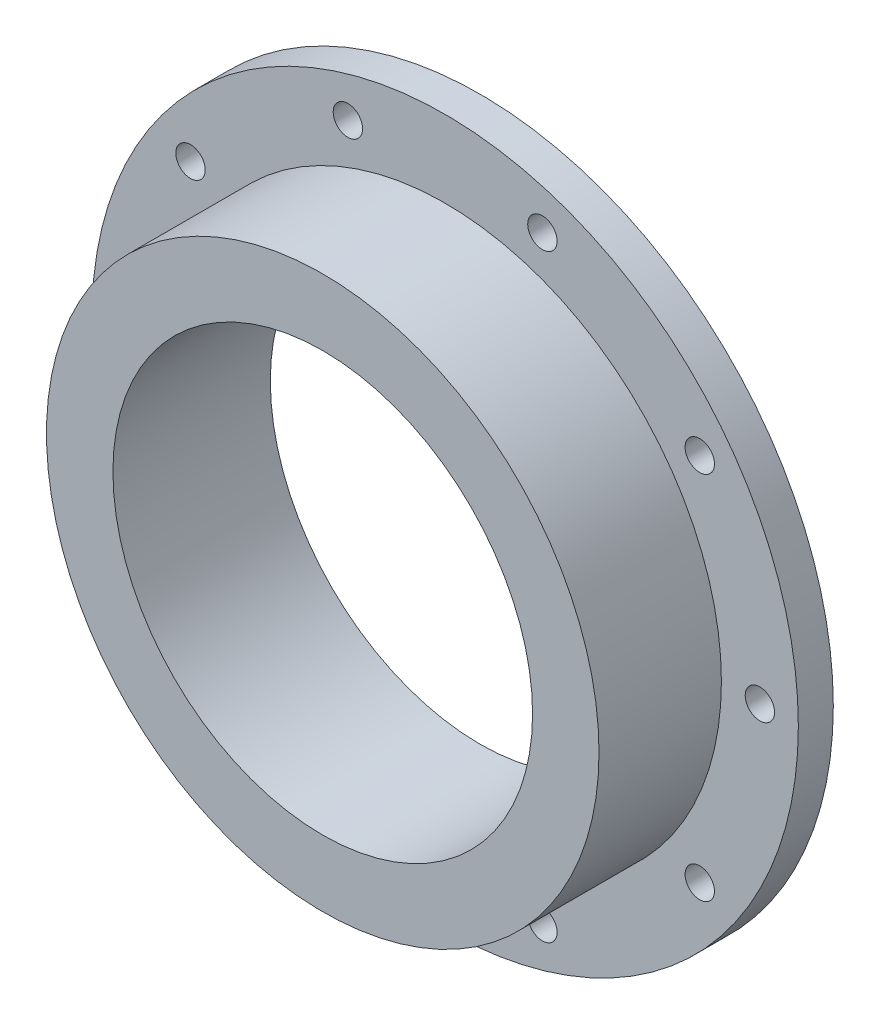
ISO-10303-21;
HEADER;
FILE_DESCRIPTION(('STEP AP214'),'2;1');
FILE_NAME('part.step','',(''),(''),'','','');
FILE_SCHEMA(('AUTOMOTIVE_DESIGN { 1 0 10303 214 1 1 1 1 }'));
ENDSEC;
DATA;
#1=APPLICATION_CONTEXT('core data for automotive mechanical design processes');
#2=APPLICATION_PROTOCOL_DEFINITION('international standard','automotive_design',2000,#1);
#3=PRODUCT_CONTEXT('',#1,'mechanical');
#4=PRODUCT('Part','Part','',(#3));
#5=PRODUCT_RELATED_PRODUCT_CATEGORY('part','',(#4));
#6=PRODUCT_DEFINITION_FORMATION('','',#4);
#7=PRODUCT_DEFINITION_CONTEXT('part definition',#1,'design');
#8=PRODUCT_DEFINITION('design','',#6,#7);
#9=PRODUCT_DEFINITION_SHAPE('','',#8);
#10=(LENGTH_UNIT() NAMED_UNIT(*) SI_UNIT(.MILLI.,.METRE.));
#11=(NAMED_UNIT(*) PLANE_ANGLE_UNIT() SI_UNIT($,.RADIAN.));
#12=(NAMED_UNIT(*) SI_UNIT($,.STERADIAN.) SOLID_ANGLE_UNIT());
#13=UNCERTAINTY_MEASURE_WITH_UNIT(LENGTH_MEASURE(1.E-05),#10,'distance_accuracy_value','');
#14=(GEOMETRIC_REPRESENTATION_CONTEXT(3) GLOBAL_UNCERTAINTY_ASSIGNED_CONTEXT((#13)) GLOBAL_UNIT_ASSIGNED_CONTEXT((#10,
#11,#12)) REPRESENTATION_CONTEXT('',''));
#15=CARTESIAN_POINT('',(0.,0.,0.));
#16=DIRECTION('',(0.,0.,1.));
#17=DIRECTION('',(1.,0.,0.));
#18=AXIS2_PLACEMENT_3D('',#15,#16,#17);
#19=CARTESIAN_POINT('',(0.,0.,-10.));
#20=DIRECTION('',(0.,0.,1.));
#21=DIRECTION('',(1.,0.,0.));
#22=AXIS2_PLACEMENT_3D('',#19,#20,#21);
#23=CYLINDRICAL_SURFACE('',#22,101.);
#24=CARTESIAN_POINT('',(0.,0.,-10.));
#25=DIRECTION('',(0.,0.,1.));
#26=DIRECTION('',(1.,0.,0.));
#27=AXIS2_PLACEMENT_3D('',#24,#25,#26);
#28=CIRCLE('',#27,101.);
#29=CARTESIAN_POINT('',(101.,0.,-10.));
#30=VERTEX_POINT('',#29);
#31=EDGE_CURVE('E46',#30,#30,#28,.T.);
#32=ORIENTED_EDGE('',*,*,#31,.T.);
#33=EDGE_LOOP('',(#32));
#34=FACE_BOUND('',#33,.T.);
#35=CARTESIAN_POINT('',(0.,0.,0.));
#36=DIRECTION('',(0.,0.,1.));
#37=DIRECTION('',(1.,0.,0.));
#38=AXIS2_PLACEMENT_3D('',#35,#36,#37);
#39=CIRCLE('',#38,101.);
#40=CARTESIAN_POINT('',(101.,0.,0.));
#41=VERTEX_POINT('',#40);
#42=EDGE_CURVE('E113',#41,#41,#39,.T.);
#43=ORIENTED_EDGE('',*,*,#42,.F.);
#44=EDGE_LOOP('',(#43));
#45=FACE_BOUND('',#44,.T.);
#46=ADVANCED_FACE('F43',(#34,#45),#23,.T.);
#47=CARTESIAN_POINT('',(101.,0.,-10.));
#48=DIRECTION('',(0.,0.,-1.));
#49=DIRECTION('',(-1.,0.,0.));
#50=AXIS2_PLACEMENT_3D('',#47,#48,#49);
#51=PLANE('',#50);
#52=CARTESIAN_POINT('',(0.,0.,-9.99999999999999));
#53=DIRECTION('',(0.,0.,-1.));
#54=DIRECTION('',(-1.,0.,0.));
#55=AXIS2_PLACEMENT_3D('',#52,#53,#54);
#56=CIRCLE('',#55,60.);
#57=CARTESIAN_POINT('',(-60.,0.,-9.99999999999999));
#58=VERTEX_POINT('',#57);
#59=EDGE_CURVE('E242',#58,#58,#56,.T.);
#60=ORIENTED_EDGE('',*,*,#59,.F.);
#61=EDGE_LOOP('',(#60));
#62=FACE_BOUND('',#61,.T.);
#63=CARTESIAN_POINT('',(-27.8115294937453,85.5950864665638,-10.));
#64=DIRECTION('',(0.,0.,-1.));
#65=DIRECTION('',(-1.,0.,0.));
#66=AXIS2_PLACEMENT_3D('',#63,#64,#65);
#67=CIRCLE('',#66,4.19999999999999);
#68=CARTESIAN_POINT('',(-32.0115294937452,85.5950864665638,-10.));
#69=VERTEX_POINT('',#68);
#70=EDGE_CURVE('E236',#69,#69,#67,.T.);
#71=ORIENTED_EDGE('',*,*,#70,.F.);
#72=EDGE_LOOP('',(#71));
#73=FACE_BOUND('',#72,.T.);
#74=CARTESIAN_POINT('',(-72.8115294937453,52.9006727063226,-10.));
#75=DIRECTION('',(0.,0.,-1.));
#76=DIRECTION('',(-1.,0.,0.));
#77=AXIS2_PLACEMENT_3D('',#74,#75,#76);
#78=CIRCLE('',#77,4.19999999999998);
#79=CARTESIAN_POINT('',(-77.0115294937453,52.9006727063226,-10.));
#80=VERTEX_POINT('',#79);
#81=EDGE_CURVE('E230',#80,#80,#78,.T.);
#82=ORIENTED_EDGE('',*,*,#81,.F.);
#83=EDGE_LOOP('',(#82));
#84=FACE_BOUND('',#83,.T.);
#85=CARTESIAN_POINT('',(-90.,0.,-10.));
#86=DIRECTION('',(0.,0.,-1.));
#87=DIRECTION('',(-1.,0.,0.));
#88=AXIS2_PLACEMENT_3D('',#85,#86,#87);
#89=CIRCLE('',#88,4.19999999999998);
#90=CARTESIAN_POINT('',(-94.2,0.,-10.));
#91=VERTEX_POINT('',#90);
#92=EDGE_CURVE('E224',#91,#91,#89,.T.);
#93=ORIENTED_EDGE('',*,*,#92,.F.);
#94=EDGE_LOOP('',(#93));
#95=FACE_BOUND('',#94,.T.);
#96=CARTESIAN_POINT('',(-72.8115294937453,-52.9006727063226,-10.));
#97=DIRECTION('',(0.,0.,-1.));
#98=DIRECTION('',(-1.,0.,0.));
#99=AXIS2_PLACEMENT_3D('',#96,#97,#98);
#100=CIRCLE('',#99,4.19999999999998);
#101=CARTESIAN_POINT('',(-77.0115294937453,-52.9006727063226,-10.));
#102=VERTEX_POINT('',#101);
#103=EDGE_CURVE('E218',#102,#102,#100,.T.);
#104=ORIENTED_EDGE('',*,*,#103,.F.);
#105=EDGE_LOOP('',(#104));
#106=FACE_BOUND('',#105,.T.);
#107=CARTESIAN_POINT('',(-27.8115294937453,-85.5950864665638,-10.));
#108=DIRECTION('',(0.,0.,-1.));
#109=DIRECTION('',(-1.,0.,0.));
#110=AXIS2_PLACEMENT_3D('',#107,#108,#109);
#111=CIRCLE('',#110,4.19999999999999);
#112=CARTESIAN_POINT('',(-32.0115294937452,-85.5950864665638,-10.));
#113=VERTEX_POINT('',#112);
#114=EDGE_CURVE('E212',#113,#113,#111,.T.);
#115=ORIENTED_EDGE('',*,*,#114,.F.);
#116=EDGE_LOOP('',(#115));
#117=FACE_BOUND('',#116,.T.);
#118=CARTESIAN_POINT('',(27.8115294937453,-85.5950864665638,-10.));
#119=DIRECTION('',(0.,0.,-1.));
#120=DIRECTION('',(-1.,0.,0.));
#121=AXIS2_PLACEMENT_3D('',#118,#119,#120);
#122=CIRCLE('',#121,4.19999999999999);
#123=CARTESIAN_POINT('',(23.6115294937453,-85.5950864665638,-10.));
#124=VERTEX_POINT('',#123);
#125=EDGE_CURVE('E206',#124,#124,#122,.T.);
#126=ORIENTED_EDGE('',*,*,#125,.F.);
#127=EDGE_LOOP('',(#126));
#128=FACE_BOUND('',#127,.T.);
#129=CARTESIAN_POINT('',(72.8115294937453,-52.9006727063226,-10.));
#130=DIRECTION('',(0.,0.,-1.));
#131=DIRECTION('',(-1.,0.,0.));
#132=AXIS2_PLACEMENT_3D('',#129,#130,#131);
#133=CIRCLE('',#132,4.19999999999998);
#134=CARTESIAN_POINT('',(68.6115294937453,-52.9006727063226,-10.));
#135=VERTEX_POINT('',#134);
#136=EDGE_CURVE('E200',#135,#135,#133,.T.);
#137=ORIENTED_EDGE('',*,*,#136,.F.);
#138=EDGE_LOOP('',(#137));
#139=FACE_BOUND('',#138,.T.);
#140=CARTESIAN_POINT('',(90.,0.,-10.));
#141=DIRECTION('',(0.,0.,-1.));
#142=DIRECTION('',(-1.,0.,0.));
#143=AXIS2_PLACEMENT_3D('',#140,#141,#142);
#144=CIRCLE('',#143,4.19999999999998);
#145=CARTESIAN_POINT('',(85.8,0.,-10.));
#146=VERTEX_POINT('',#145);
#147=EDGE_CURVE('E194',#146,#146,#144,.T.);
#148=ORIENTED_EDGE('',*,*,#147,.F.);
#149=EDGE_LOOP('',(#148));
#150=FACE_BOUND('',#149,.T.);
#151=CARTESIAN_POINT('',(72.8115294937453,52.9006727063226,-10.));
#152=DIRECTION('',(0.,0.,-1.));
#153=DIRECTION('',(-1.,0.,0.));
#154=AXIS2_PLACEMENT_3D('',#151,#152,#153);
#155=CIRCLE('',#154,4.19999999999998);
#156=CARTESIAN_POINT('',(68.6115294937453,52.9006727063226,-10.));
#157=VERTEX_POINT('',#156);
#158=EDGE_CURVE('E188',#157,#157,#155,.T.);
#159=ORIENTED_EDGE('',*,*,#158,.F.);
#160=EDGE_LOOP('',(#159));
#161=FACE_BOUND('',#160,.T.);
#162=CARTESIAN_POINT('',(27.8115294937453,85.5950864665638,-10.));
#163=DIRECTION('',(0.,0.,-1.));
#164=DIRECTION('',(-1.,0.,0.));
#165=AXIS2_PLACEMENT_3D('',#162,#163,#164);
#166=CIRCLE('',#165,4.19999999999999);
#167=CARTESIAN_POINT('',(23.6115294937453,85.5950864665638,-10.));
#168=VERTEX_POINT('',#167);
#169=EDGE_CURVE('E182',#168,#168,#166,.T.);
#170=ORIENTED_EDGE('',*,*,#169,.F.);
#171=EDGE_LOOP('',(#170));
#172=FACE_BOUND('',#171,.T.);
#173=CARTESIAN_POINT('',(-40.8510750343269,56.2266811090589,-10.));
#174=DIRECTION('',(0.,0.,1.));
#175=DIRECTION('',(1.,0.,0.));
#176=AXIS2_PLACEMENT_3D('',#173,#174,#175);
#177=CIRCLE('',#176,3.3235);
#178=CARTESIAN_POINT('',(-37.5275750343269,56.2266811090589,-10.));
#179=VERTEX_POINT('',#178);
#180=EDGE_CURVE('E173',#179,#179,#177,.T.);
#181=ORIENTED_EDGE('',*,*,#180,.T.);
#182=EDGE_LOOP('',(#181));
#183=FACE_BOUND('',#182,.T.);
#184=CARTESIAN_POINT('',(-66.0984278825132,21.4766811090588,-10.));
#185=DIRECTION('',(0.,0.,1.));
#186=DIRECTION('',(1.,0.,0.));
#187=AXIS2_PLACEMENT_3D('',#184,#185,#186);
#188=CIRCLE('',#187,3.32349999999999);
#189=CARTESIAN_POINT('',(-62.7749278825132,21.4766811090588,-10.));
#190=VERTEX_POINT('',#189);
#191=EDGE_CURVE('E167',#190,#190,#188,.T.);
#192=ORIENTED_EDGE('',*,*,#191,.T.);
#193=EDGE_LOOP('',(#192));
#194=FACE_BOUND('',#193,.T.);
#195=CARTESIAN_POINT('',(-66.0984278825132,-21.4766811090588,-10.));
#196=DIRECTION('',(0.,0.,1.));
#197=DIRECTION('',(1.,0.,0.));
#198=AXIS2_PLACEMENT_3D('',#195,#196,#197);
#199=CIRCLE('',#198,3.32349999999999);
#200=CARTESIAN_POINT('',(-62.7749278825132,-21.4766811090588,-10.));
#201=VERTEX_POINT('',#200);
#202=EDGE_CURVE('E161',#201,#201,#199,.T.);
#203=ORIENTED_EDGE('',*,*,#202,.T.);
#204=EDGE_LOOP('',(#203));
#205=FACE_BOUND('',#204,.T.);
#206=CARTESIAN_POINT('',(-40.8510750343269,-56.2266811090589,-10.));
#207=DIRECTION('',(0.,0.,1.));
#208=DIRECTION('',(1.,0.,0.));
#209=AXIS2_PLACEMENT_3D('',#206,#207,#208);
#210=CIRCLE('',#209,3.3235);
#211=CARTESIAN_POINT('',(-37.5275750343269,-56.2266811090589,-10.));
#212=VERTEX_POINT('',#211);
#213=EDGE_CURVE('E155',#212,#212,#210,.T.);
#214=ORIENTED_EDGE('',*,*,#213,.T.);
#215=EDGE_LOOP('',(#214));
#216=FACE_BOUND('',#215,.T.);
#217=CARTESIAN_POINT('',(0.,-69.5,-10.));
#218=DIRECTION('',(0.,0.,1.));
#219=DIRECTION('',(1.,0.,0.));
#220=AXIS2_PLACEMENT_3D('',#217,#218,#219);
#221=CIRCLE('',#220,3.3235);
#222=CARTESIAN_POINT('',(3.32350000000001,-69.5,-10.));
#223=VERTEX_POINT('',#222);
#224=EDGE_CURVE('E149',#223,#223,#221,.T.);
#225=ORIENTED_EDGE('',*,*,#224,.T.);
#226=EDGE_LOOP('',(#225));
#227=FACE_BOUND('',#226,.T.);
#228=CARTESIAN_POINT('',(40.8510750343269,-56.2266811090589,-10.));
#229=DIRECTION('',(0.,0.,1.));
#230=DIRECTION('',(1.,0.,0.));
#231=AXIS2_PLACEMENT_3D('',#228,#229,#230);
#232=CIRCLE('',#231,3.3235);
#233=CARTESIAN_POINT('',(44.1745750343269,-56.2266811090589,-10.));
#234=VERTEX_POINT('',#233);
#235=EDGE_CURVE('E143',#234,#234,#232,.T.);
#236=ORIENTED_EDGE('',*,*,#235,.T.);
#237=EDGE_LOOP('',(#236));
#238=FACE_BOUND('',#237,.T.);
#239=CARTESIAN_POINT('',(66.0984278825132,-21.4766811090588,-10.));
#240=DIRECTION('',(0.,0.,1.));
#241=DIRECTION('',(1.,0.,0.));
#242=AXIS2_PLACEMENT_3D('',#239,#240,#241);
#243=CIRCLE('',#242,3.32349999999999);
#244=CARTESIAN_POINT('',(69.4219278825132,-21.4766811090588,-10.));
#245=VERTEX_POINT('',#244);
#246=EDGE_CURVE('E137',#245,#245,#243,.T.);
#247=ORIENTED_EDGE('',*,*,#246,.T.);
#248=EDGE_LOOP('',(#247));
#249=FACE_BOUND('',#248,.T.);
#250=CARTESIAN_POINT('',(66.0984278825132,21.4766811090588,-10.));
#251=DIRECTION('',(0.,0.,1.));
#252=DIRECTION('',(1.,0.,0.));
#253=AXIS2_PLACEMENT_3D('',#250,#251,#252);
#254=CIRCLE('',#253,3.32349999999999);
#255=CARTESIAN_POINT('',(69.4219278825132,21.4766811090588,-10.));
#256=VERTEX_POINT('',#255);
#257=EDGE_CURVE('E131',#256,#256,#254,.T.);
#258=ORIENTED_EDGE('',*,*,#257,.T.);
#259=EDGE_LOOP('',(#258));
#260=FACE_BOUND('',#259,.T.);
#261=CARTESIAN_POINT('',(40.8510750343269,56.2266811090589,-10.));
#262=DIRECTION('',(0.,0.,1.));
#263=DIRECTION('',(1.,0.,0.));
#264=AXIS2_PLACEMENT_3D('',#261,#262,#263);
#265=CIRCLE('',#264,3.3235);
#266=CARTESIAN_POINT('',(44.1745750343269,56.2266811090589,-10.));
#267=VERTEX_POINT('',#266);
#268=EDGE_CURVE('E125',#267,#267,#265,.T.);
#269=ORIENTED_EDGE('',*,*,#268,.T.);
#270=EDGE_LOOP('',(#269));
#271=FACE_BOUND('',#270,.T.);
#272=CARTESIAN_POINT('',(0.,69.5,-10.));
#273=DIRECTION('',(0.,0.,1.));
#274=DIRECTION('',(1.,0.,0.));
#275=AXIS2_PLACEMENT_3D('',#272,#273,#274);
#276=CIRCLE('',#275,3.3235);
#277=CARTESIAN_POINT('',(3.3235,69.5,-10.));
#278=VERTEX_POINT('',#277);
#279=EDGE_CURVE('E117',#278,#278,#276,.T.);
#280=ORIENTED_EDGE('',*,*,#279,.T.);
#281=EDGE_LOOP('',(#280));
#282=FACE_BOUND('',#281,.T.);
#283=ORIENTED_EDGE('',*,*,#31,.F.);
#284=EDGE_LOOP('',(#283));
#285=FACE_BOUND('',#284,.T.);
#286=ADVANCED_FACE('F100',(#62,#73,#84,#95,#106,#117,#128,#139,#150,#161,#172,#183,#194,#205,
#216,#227,#238,#249,#260,#271,#282,#285),#51,.T.);
#287=CARTESIAN_POINT('',(0.,0.,0.));
#288=DIRECTION('',(0.,0.,1.));
#289=DIRECTION('',(1.,0.,0.));
#290=AXIS2_PLACEMENT_3D('',#287,#288,#289);
#291=PLANE('',#290);
#292=CARTESIAN_POINT('',(-27.8115294937453,85.5950864665638,0.));
#293=DIRECTION('',(0.,0.,1.));
#294=DIRECTION('',(1.,0.,0.));
#295=AXIS2_PLACEMENT_3D('',#292,#293,#294);
#296=CIRCLE('',#295,4.19999999999998);
#297=CARTESIAN_POINT('',(-23.6115294937453,85.5950864665638,0.));
#298=VERTEX_POINT('',#297);
#299=EDGE_CURVE('E233',#298,#298,#296,.T.);
#300=ORIENTED_EDGE('',*,*,#299,.F.);
#301=EDGE_LOOP('',(#300));
#302=FACE_BOUND('',#301,.T.);
#303=CARTESIAN_POINT('',(-72.8115294937453,52.9006727063226,0.));
#304=DIRECTION('',(0.,0.,1.));
#305=DIRECTION('',(1.,0.,0.));
#306=AXIS2_PLACEMENT_3D('',#303,#304,#305);
#307=CIRCLE('',#306,4.19999999999998);
#308=CARTESIAN_POINT('',(-68.6115294937453,52.9006727063226,0.));
#309=VERTEX_POINT('',#308);
#310=EDGE_CURVE('E227',#309,#309,#307,.T.);
#311=ORIENTED_EDGE('',*,*,#310,.F.);
#312=EDGE_LOOP('',(#311));
#313=FACE_BOUND('',#312,.T.);
#314=CARTESIAN_POINT('',(-90.,0.,0.));
#315=DIRECTION('',(0.,0.,1.));
#316=DIRECTION('',(1.,0.,0.));
#317=AXIS2_PLACEMENT_3D('',#314,#315,#316);
#318=CIRCLE('',#317,4.19999999999998);
#319=CARTESIAN_POINT('',(-85.8,0.,0.));
#320=VERTEX_POINT('',#319);
#321=EDGE_CURVE('E221',#320,#320,#318,.T.);
#322=ORIENTED_EDGE('',*,*,#321,.F.);
#323=EDGE_LOOP('',(#322));
#324=FACE_BOUND('',#323,.T.);
#325=CARTESIAN_POINT('',(-72.8115294937453,-52.9006727063226,0.));
#326=DIRECTION('',(0.,0.,1.));
#327=DIRECTION('',(1.,0.,0.));
#328=AXIS2_PLACEMENT_3D('',#325,#326,#327);
#329=CIRCLE('',#328,4.19999999999998);
#330=CARTESIAN_POINT('',(-68.6115294937453,-52.9006727063226,0.));
#331=VERTEX_POINT('',#330);
#332=EDGE_CURVE('E215',#331,#331,#329,.T.);
#333=ORIENTED_EDGE('',*,*,#332,.F.);
#334=EDGE_LOOP('',(#333));
#335=FACE_BOUND('',#334,.T.);
#336=CARTESIAN_POINT('',(-27.8115294937453,-85.5950864665638,0.));
#337=DIRECTION('',(0.,0.,1.));
#338=DIRECTION('',(1.,0.,0.));
#339=AXIS2_PLACEMENT_3D('',#336,#337,#338);
#340=CIRCLE('',#339,4.19999999999998);
#341=CARTESIAN_POINT('',(-23.6115294937453,-85.5950864665638,0.));
#342=VERTEX_POINT('',#341);
#343=EDGE_CURVE('E209',#342,#342,#340,.T.);
#344=ORIENTED_EDGE('',*,*,#343,.F.);
#345=EDGE_LOOP('',(#344));
#346=FACE_BOUND('',#345,.T.);
#347=CARTESIAN_POINT('',(27.8115294937453,-85.5950864665638,0.));
#348=DIRECTION('',(0.,0.,1.));
#349=DIRECTION('',(1.,0.,0.));
#350=AXIS2_PLACEMENT_3D('',#347,#348,#349);
#351=CIRCLE('',#350,4.19999999999998);
#352=CARTESIAN_POINT('',(32.0115294937453,-85.5950864665638,0.));
#353=VERTEX_POINT('',#352);
#354=EDGE_CURVE('E203',#353,#353,#351,.T.);
#355=ORIENTED_EDGE('',*,*,#354,.F.);
#356=EDGE_LOOP('',(#355));
#357=FACE_BOUND('',#356,.T.);
#358=CARTESIAN_POINT('',(72.8115294937453,-52.9006727063226,0.));
#359=DIRECTION('',(0.,0.,1.));
#360=DIRECTION('',(1.,0.,0.));
#361=AXIS2_PLACEMENT_3D('',#358,#359,#360);
#362=CIRCLE('',#361,4.19999999999998);
#363=CARTESIAN_POINT('',(77.0115294937453,-52.9006727063226,0.));
#364=VERTEX_POINT('',#363);
#365=EDGE_CURVE('E197',#364,#364,#362,.T.);
#366=ORIENTED_EDGE('',*,*,#365,.F.);
#367=EDGE_LOOP('',(#366));
#368=FACE_BOUND('',#367,.T.);
#369=CARTESIAN_POINT('',(90.,0.,0.));
#370=DIRECTION('',(0.,0.,1.));
#371=DIRECTION('',(1.,0.,0.));
#372=AXIS2_PLACEMENT_3D('',#369,#370,#371);
#373=CIRCLE('',#372,4.19999999999998);
#374=CARTESIAN_POINT('',(94.2,0.,0.));
#375=VERTEX_POINT('',#374);
#376=EDGE_CURVE('E191',#375,#375,#373,.T.);
#377=ORIENTED_EDGE('',*,*,#376,.F.);
#378=EDGE_LOOP('',(#377));
#379=FACE_BOUND('',#378,.T.);
#380=CARTESIAN_POINT('',(72.8115294937453,52.9006727063226,0.));
#381=DIRECTION('',(0.,0.,1.));
#382=DIRECTION('',(1.,0.,0.));
#383=AXIS2_PLACEMENT_3D('',#380,#381,#382);
#384=CIRCLE('',#383,4.19999999999998);
#385=CARTESIAN_POINT('',(77.0115294937453,52.9006727063226,0.));
#386=VERTEX_POINT('',#385);
#387=EDGE_CURVE('E185',#386,#386,#384,.T.);
#388=ORIENTED_EDGE('',*,*,#387,.F.);
#389=EDGE_LOOP('',(#388));
#390=FACE_BOUND('',#389,.T.);
#391=CARTESIAN_POINT('',(27.8115294937453,85.5950864665638,0.));
#392=DIRECTION('',(0.,0.,1.));
#393=DIRECTION('',(1.,0.,0.));
#394=AXIS2_PLACEMENT_3D('',#391,#392,#393);
#395=CIRCLE('',#394,4.19999999999998);
#396=CARTESIAN_POINT('',(32.0115294937453,85.5950864665638,0.));
#397=VERTEX_POINT('',#396);
#398=EDGE_CURVE('E179',#397,#397,#395,.T.);
#399=ORIENTED_EDGE('',*,*,#398,.F.);
#400=EDGE_LOOP('',(#399));
#401=FACE_BOUND('',#400,.T.);
#402=CARTESIAN_POINT('',(0.,0.,0.));
#403=DIRECTION('',(0.,0.,1.));
#404=DIRECTION('',(1.,0.,0.));
#405=AXIS2_PLACEMENT_3D('',#402,#403,#404);
#406=CIRCLE('',#405,79.);
#407=CARTESIAN_POINT('',(79.,0.,0.));
#408=VERTEX_POINT('',#407);
#409=EDGE_CURVE('E11',#408,#408,#406,.T.);
#410=ORIENTED_EDGE('',*,*,#409,.F.);
#411=EDGE_LOOP('',(#410));
#412=FACE_BOUND('',#411,.T.);
#413=ORIENTED_EDGE('',*,*,#42,.T.);
#414=EDGE_LOOP('',(#413));
#415=FACE_BOUND('',#414,.T.);
#416=ADVANCED_FACE('F106',(#302,#313,#324,#335,#346,#357,#368,#379,#390,#401,#412,#415),#291,.T.);
#417=CARTESIAN_POINT('',(0.,0.,35.));
#418=DIRECTION('',(0.,0.,-1.));
#419=DIRECTION('',(-1.,0.,0.));
#420=AXIS2_PLACEMENT_3D('',#417,#418,#419);
#421=CYLINDRICAL_SURFACE('',#420,79.);
#422=CARTESIAN_POINT('',(0.,0.,35.));
#423=DIRECTION('',(0.,0.,1.));
#424=DIRECTION('',(1.,0.,0.));
#425=AXIS2_PLACEMENT_3D('',#422,#423,#424);
#426=CIRCLE('',#425,79.);
#427=CARTESIAN_POINT('',(79.,0.,35.));
#428=VERTEX_POINT('',#427);
#429=EDGE_CURVE('E115',#428,#428,#426,.T.);
#430=ORIENTED_EDGE('',*,*,#429,.F.);
#431=EDGE_LOOP('',(#430));
#432=FACE_BOUND('',#431,.T.);
#433=ORIENTED_EDGE('',*,*,#409,.T.);
#434=EDGE_LOOP('',(#433));
#435=FACE_BOUND('',#434,.T.);
#436=ADVANCED_FACE('F303',(#432,#435),#421,.T.);
#437=CARTESIAN_POINT('',(0.,0.,35.));
#438=DIRECTION('',(0.,0.,1.));
#439=DIRECTION('',(1.,0.,0.));
#440=AXIS2_PLACEMENT_3D('',#437,#438,#439);
#441=PLANE('',#440);
#442=CARTESIAN_POINT('',(0.,0.,35.));
#443=DIRECTION('',(0.,0.,-1.));
#444=DIRECTION('',(-1.,0.,0.));
#445=AXIS2_PLACEMENT_3D('',#442,#443,#444);
#446=CIRCLE('',#445,60.);
#447=CARTESIAN_POINT('',(-60.,0.,35.));
#448=VERTEX_POINT('',#447);
#449=EDGE_CURVE('E239',#448,#448,#446,.T.);
#450=ORIENTED_EDGE('',*,*,#449,.T.);
#451=EDGE_LOOP('',(#450));
#452=FACE_BOUND('',#451,.T.);
#453=ORIENTED_EDGE('',*,*,#429,.T.);
#454=EDGE_LOOP('',(#453));
#455=FACE_BOUND('',#454,.T.);
#456=ADVANCED_FACE('F298',(#452,#455),#441,.T.);
#457=CARTESIAN_POINT('',(0.,69.5,5.));
#458=DIRECTION('',(0.,0.,-1.));
#459=DIRECTION('',(-1.,0.,0.));
#460=AXIS2_PLACEMENT_3D('',#457,#458,#459);
#461=CONICAL_SURFACE('',#460,0.,1.02974425867665);
#462=CARTESIAN_POINT('',(0.,69.5,3.0030397326619));
#463=DIRECTION('',(0.,0.,1.));
#464=DIRECTION('',(1.,0.,0.));
#465=AXIS2_PLACEMENT_3D('',#462,#463,#464);
#466=CIRCLE('',#465,3.3235);
#467=CARTESIAN_POINT('',(3.3235,69.5,3.0030397326619));
#468=VERTEX_POINT('',#467);
#469=EDGE_CURVE('E122',#468,#468,#466,.T.);
#470=ORIENTED_EDGE('',*,*,#469,.F.);
#471=EDGE_LOOP('',(#470));
#472=FACE_BOUND('',#471,.T.);
#473=CARTESIAN_POINT('',(0.,69.5,5.));
#474=VERTEX_POINT('',#473);
#475=VERTEX_LOOP('',#474);
#476=FACE_BOUND('',#475,.T.);
#477=ADVANCED_FACE('F293',(#472,#476),#461,.F.);
#478=CARTESIAN_POINT('',(0.,69.5,-10.));
#479=DIRECTION('',(0.,0.,1.));
#480=DIRECTION('',(1.,0.,0.));
#481=AXIS2_PLACEMENT_3D('',#478,#479,#480);
#482=CYLINDRICAL_SURFACE('',#481,3.3235);
#483=ORIENTED_EDGE('',*,*,#279,.F.);
#484=EDGE_LOOP('',(#483));
#485=FACE_BOUND('',#484,.T.);
#486=ORIENTED_EDGE('',*,*,#469,.T.);
#487=EDGE_LOOP('',(#486));
#488=FACE_BOUND('',#487,.T.);
#489=ADVANCED_FACE('F289',(#485,#488),#482,.F.);
#490=CARTESIAN_POINT('',(40.8510750343269,56.2266811090589,5.));
#491=DIRECTION('',(0.,0.,-1.));
#492=DIRECTION('',(-1.,0.,0.));
#493=AXIS2_PLACEMENT_3D('',#490,#491,#492);
#494=CONICAL_SURFACE('',#493,0.,1.02974425867665);
#495=CARTESIAN_POINT('',(40.8510750343269,56.2266811090589,3.0030397326619));
#496=DIRECTION('',(0.,0.,1.));
#497=DIRECTION('',(1.,0.,0.));
#498=AXIS2_PLACEMENT_3D('',#495,#496,#497);
#499=CIRCLE('',#498,3.3235);
#500=CARTESIAN_POINT('',(44.1745750343269,56.2266811090589,3.0030397326619));
#501=VERTEX_POINT('',#500);
#502=EDGE_CURVE('E128',#501,#501,#499,.T.);
#503=ORIENTED_EDGE('',*,*,#502,.F.);
#504=EDGE_LOOP('',(#503));
#505=FACE_BOUND('',#504,.T.);
#506=CARTESIAN_POINT('',(40.8510750343269,56.2266811090589,5.));
#507=VERTEX_POINT('',#506);
#508=VERTEX_LOOP('',#507);
#509=FACE_BOUND('',#508,.T.);
#510=ADVANCED_FACE('F292',(#505,#509),#494,.F.);
#511=CARTESIAN_POINT('',(40.8510750343269,56.2266811090589,-10.));
#512=DIRECTION('',(0.,0.,1.));
#513=DIRECTION('',(1.,0.,0.));
#514=AXIS2_PLACEMENT_3D('',#511,#512,#513);
#515=CYLINDRICAL_SURFACE('',#514,3.3235);
#516=ORIENTED_EDGE('',*,*,#268,.F.);
#517=EDGE_LOOP('',(#516));
#518=FACE_BOUND('',#517,.T.);
#519=ORIENTED_EDGE('',*,*,#502,.T.);
#520=EDGE_LOOP('',(#519));
#521=FACE_BOUND('',#520,.T.);
#522=ADVANCED_FACE('F583',(#518,#521),#515,.F.);
#523=CARTESIAN_POINT('',(66.0984278825132,21.4766811090588,5.));
#524=DIRECTION('',(0.,0.,-1.));
#525=DIRECTION('',(-1.,0.,0.));
#526=AXIS2_PLACEMENT_3D('',#523,#524,#525);
#527=CONICAL_SURFACE('',#526,0.,1.02974425867665);
#528=CARTESIAN_POINT('',(66.0984278825132,21.4766811090588,3.0030397326619));
#529=DIRECTION('',(0.,0.,1.));
#530=DIRECTION('',(1.,0.,0.));
#531=AXIS2_PLACEMENT_3D('',#528,#529,#530);
#532=CIRCLE('',#531,3.32349999999999);
#533=CARTESIAN_POINT('',(69.4219278825132,21.4766811090588,3.0030397326619));
#534=VERTEX_POINT('',#533);
#535=EDGE_CURVE('E134',#534,#534,#532,.T.);
#536=ORIENTED_EDGE('',*,*,#535,.F.);
#537=EDGE_LOOP('',(#536));
#538=FACE_BOUND('',#537,.T.);
#539=CARTESIAN_POINT('',(66.0984278825132,21.4766811090588,5.));
#540=VERTEX_POINT('',#539);
#541=VERTEX_LOOP('',#540);
#542=FACE_BOUND('',#541,.T.);
#543=ADVANCED_FACE('F574',(#538,#542),#527,.F.);
#544=CARTESIAN_POINT('',(66.0984278825132,21.4766811090588,-10.));
#545=DIRECTION('',(0.,0.,1.));
#546=DIRECTION('',(1.,0.,0.));
#547=AXIS2_PLACEMENT_3D('',#544,#545,#546);
#548=CYLINDRICAL_SURFACE('',#547,3.32349999999999);
#549=ORIENTED_EDGE('',*,*,#257,.F.);
#550=EDGE_LOOP('',(#549));
#551=FACE_BOUND('',#550,.T.);
#552=ORIENTED_EDGE('',*,*,#535,.T.);
#553=EDGE_LOOP('',(#552));
#554=FACE_BOUND('',#553,.T.);
#555=ADVANCED_FACE('F565',(#551,#554),#548,.F.);
#556=CARTESIAN_POINT('',(66.0984278825132,-21.4766811090588,5.));
#557=DIRECTION('',(0.,0.,-1.));
#558=DIRECTION('',(-1.,0.,0.));
#559=AXIS2_PLACEMENT_3D('',#556,#557,#558);
#560=CONICAL_SURFACE('',#559,0.,1.02974425867665);
#561=CARTESIAN_POINT('',(66.0984278825132,-21.4766811090588,3.0030397326619));
#562=DIRECTION('',(0.,0.,1.));
#563=DIRECTION('',(1.,0.,0.));
#564=AXIS2_PLACEMENT_3D('',#561,#562,#563);
#565=CIRCLE('',#564,3.32349999999999);
#566=CARTESIAN_POINT('',(69.4219278825132,-21.4766811090588,3.0030397326619));
#567=VERTEX_POINT('',#566);
#568=EDGE_CURVE('E140',#567,#567,#565,.T.);
#569=ORIENTED_EDGE('',*,*,#568,.F.);
#570=EDGE_LOOP('',(#569));
#571=FACE_BOUND('',#570,.T.);
#572=CARTESIAN_POINT('',(66.0984278825132,-21.4766811090588,5.));
#573=VERTEX_POINT('',#572);
#574=VERTEX_LOOP('',#573);
#575=FACE_BOUND('',#574,.T.);
#576=ADVANCED_FACE('F556',(#571,#575),#560,.F.);
#577=CARTESIAN_POINT('',(66.0984278825132,-21.4766811090588,-10.));
#578=DIRECTION('',(0.,0.,1.));
#579=DIRECTION('',(1.,0.,0.));
#580=AXIS2_PLACEMENT_3D('',#577,#578,#579);
#581=CYLINDRICAL_SURFACE('',#580,3.32349999999999);
#582=ORIENTED_EDGE('',*,*,#246,.F.);
#583=EDGE_LOOP('',(#582));
#584=FACE_BOUND('',#583,.T.);
#585=ORIENTED_EDGE('',*,*,#568,.T.);
#586=EDGE_LOOP('',(#585));
#587=FACE_BOUND('',#586,.T.);
#588=ADVANCED_FACE('F547',(#584,#587),#581,.F.);
#589=CARTESIAN_POINT('',(40.8510750343269,-56.2266811090589,5.));
#590=DIRECTION('',(0.,0.,-1.));
#591=DIRECTION('',(-1.,0.,0.));
#592=AXIS2_PLACEMENT_3D('',#589,#590,#591);
#593=CONICAL_SURFACE('',#592,0.,1.02974425867665);
#594=CARTESIAN_POINT('',(40.8510750343269,-56.2266811090589,3.0030397326619));
#595=DIRECTION('',(0.,0.,1.));
#596=DIRECTION('',(1.,0.,0.));
#597=AXIS2_PLACEMENT_3D('',#594,#595,#596);
#598=CIRCLE('',#597,3.3235);
#599=CARTESIAN_POINT('',(44.1745750343269,-56.2266811090589,3.0030397326619));
#600=VERTEX_POINT('',#599);
#601=EDGE_CURVE('E146',#600,#600,#598,.T.);
#602=ORIENTED_EDGE('',*,*,#601,.F.);
#603=EDGE_LOOP('',(#602));
#604=FACE_BOUND('',#603,.T.);
#605=CARTESIAN_POINT('',(40.8510750343269,-56.2266811090589,5.));
#606=VERTEX_POINT('',#605);
#607=VERTEX_LOOP('',#606);
#608=FACE_BOUND('',#607,.T.);
#609=ADVANCED_FACE('F538',(#604,#608),#593,.F.);
#610=CARTESIAN_POINT('',(40.8510750343269,-56.2266811090589,-10.));
#611=DIRECTION('',(0.,0.,1.));
#612=DIRECTION('',(1.,0.,0.));
#613=AXIS2_PLACEMENT_3D('',#610,#611,#612);
#614=CYLINDRICAL_SURFACE('',#613,3.3235);
#615=ORIENTED_EDGE('',*,*,#235,.F.);
#616=EDGE_LOOP('',(#615));
#617=FACE_BOUND('',#616,.T.);
#618=ORIENTED_EDGE('',*,*,#601,.T.);
#619=EDGE_LOOP('',(#618));
#620=FACE_BOUND('',#619,.T.);
#621=ADVANCED_FACE('F529',(#617,#620),#614,.F.);
#622=CARTESIAN_POINT('',(0.,-69.5,5.));
#623=DIRECTION('',(0.,0.,-1.));
#624=DIRECTION('',(-1.,0.,0.));
#625=AXIS2_PLACEMENT_3D('',#622,#623,#624);
#626=CONICAL_SURFACE('',#625,0.,1.02974425867665);
#627=CARTESIAN_POINT('',(0.,-69.5,3.0030397326619));
#628=DIRECTION('',(0.,0.,1.));
#629=DIRECTION('',(1.,0.,0.));
#630=AXIS2_PLACEMENT_3D('',#627,#628,#629);
#631=CIRCLE('',#630,3.3235);
#632=CARTESIAN_POINT('',(3.32350000000001,-69.5,3.0030397326619));
#633=VERTEX_POINT('',#632);
#634=EDGE_CURVE('E152',#633,#633,#631,.T.);
#635=ORIENTED_EDGE('',*,*,#634,.F.);
#636=EDGE_LOOP('',(#635));
#637=FACE_BOUND('',#636,.T.);
#638=CARTESIAN_POINT('',(0.,-69.5,5.));
#639=VERTEX_POINT('',#638);
#640=VERTEX_LOOP('',#639);
#641=FACE_BOUND('',#640,.T.);
#642=ADVANCED_FACE('F520',(#637,#641),#626,.F.);
#643=CARTESIAN_POINT('',(0.,-69.5,-10.));
#644=DIRECTION('',(0.,0.,1.));
#645=DIRECTION('',(1.,0.,0.));
#646=AXIS2_PLACEMENT_3D('',#643,#644,#645);
#647=CYLINDRICAL_SURFACE('',#646,3.3235);
#648=ORIENTED_EDGE('',*,*,#224,.F.);
#649=EDGE_LOOP('',(#648));
#650=FACE_BOUND('',#649,.T.);
#651=ORIENTED_EDGE('',*,*,#634,.T.);
#652=EDGE_LOOP('',(#651));
#653=FACE_BOUND('',#652,.T.);
#654=ADVANCED_FACE('F511',(#650,#653),#647,.F.);
#655=CARTESIAN_POINT('',(-40.8510750343269,-56.2266811090589,5.));
#656=DIRECTION('',(0.,0.,-1.));
#657=DIRECTION('',(-1.,0.,0.));
#658=AXIS2_PLACEMENT_3D('',#655,#656,#657);
#659=CONICAL_SURFACE('',#658,0.,1.02974425867665);
#660=CARTESIAN_POINT('',(-40.8510750343269,-56.2266811090589,3.0030397326619));
#661=DIRECTION('',(0.,0.,1.));
#662=DIRECTION('',(1.,0.,0.));
#663=AXIS2_PLACEMENT_3D('',#660,#661,#662);
#664=CIRCLE('',#663,3.3235);
#665=CARTESIAN_POINT('',(-37.5275750343269,-56.2266811090589,3.0030397326619));
#666=VERTEX_POINT('',#665);
#667=EDGE_CURVE('E158',#666,#666,#664,.T.);
#668=ORIENTED_EDGE('',*,*,#667,.F.);
#669=EDGE_LOOP('',(#668));
#670=FACE_BOUND('',#669,.T.);
#671=CARTESIAN_POINT('',(-40.8510750343269,-56.2266811090589,5.));
#672=VERTEX_POINT('',#671);
#673=VERTEX_LOOP('',#672);
#674=FACE_BOUND('',#673,.T.);
#675=ADVANCED_FACE('F502',(#670,#674),#659,.F.);
#676=CARTESIAN_POINT('',(-40.8510750343269,-56.2266811090589,-10.));
#677=DIRECTION('',(0.,0.,1.));
#678=DIRECTION('',(1.,0.,0.));
#679=AXIS2_PLACEMENT_3D('',#676,#677,#678);
#680=CYLINDRICAL_SURFACE('',#679,3.3235);
#681=ORIENTED_EDGE('',*,*,#213,.F.);
#682=EDGE_LOOP('',(#681));
#683=FACE_BOUND('',#682,.T.);
#684=ORIENTED_EDGE('',*,*,#667,.T.);
#685=EDGE_LOOP('',(#684));
#686=FACE_BOUND('',#685,.T.);
#687=ADVANCED_FACE('F493',(#683,#686),#680,.F.);
#688=CARTESIAN_POINT('',(-66.0984278825132,-21.4766811090588,5.));
#689=DIRECTION('',(0.,0.,-1.));
#690=DIRECTION('',(-1.,0.,0.));
#691=AXIS2_PLACEMENT_3D('',#688,#689,#690);
#692=CONICAL_SURFACE('',#691,0.,1.02974425867665);
#693=CARTESIAN_POINT('',(-66.0984278825132,-21.4766811090588,3.0030397326619));
#694=DIRECTION('',(0.,0.,1.));
#695=DIRECTION('',(1.,0.,0.));
#696=AXIS2_PLACEMENT_3D('',#693,#694,#695);
#697=CIRCLE('',#696,3.32349999999999);
#698=CARTESIAN_POINT('',(-62.7749278825132,-21.4766811090588,3.0030397326619));
#699=VERTEX_POINT('',#698);
#700=EDGE_CURVE('E164',#699,#699,#697,.T.);
#701=ORIENTED_EDGE('',*,*,#700,.F.);
#702=EDGE_LOOP('',(#701));
#703=FACE_BOUND('',#702,.T.);
#704=CARTESIAN_POINT('',(-66.0984278825132,-21.4766811090588,5.));
#705=VERTEX_POINT('',#704);
#706=VERTEX_LOOP('',#705);
#707=FACE_BOUND('',#706,.T.);
#708=ADVANCED_FACE('F484',(#703,#707),#692,.F.);
#709=CARTESIAN_POINT('',(-66.0984278825132,-21.4766811090588,-10.));
#710=DIRECTION('',(0.,0.,1.));
#711=DIRECTION('',(1.,0.,0.));
#712=AXIS2_PLACEMENT_3D('',#709,#710,#711);
#713=CYLINDRICAL_SURFACE('',#712,3.32349999999999);
#714=ORIENTED_EDGE('',*,*,#202,.F.);
#715=EDGE_LOOP('',(#714));
#716=FACE_BOUND('',#715,.T.);
#717=ORIENTED_EDGE('',*,*,#700,.T.);
#718=EDGE_LOOP('',(#717));
#719=FACE_BOUND('',#718,.T.);
#720=ADVANCED_FACE('F475',(#716,#719),#713,.F.);
#721=CARTESIAN_POINT('',(-66.0984278825132,21.4766811090588,5.));
#722=DIRECTION('',(0.,0.,-1.));
#723=DIRECTION('',(-1.,0.,0.));
#724=AXIS2_PLACEMENT_3D('',#721,#722,#723);
#725=CONICAL_SURFACE('',#724,0.,1.02974425867665);
#726=CARTESIAN_POINT('',(-66.0984278825132,21.4766811090588,3.0030397326619));
#727=DIRECTION('',(0.,0.,1.));
#728=DIRECTION('',(1.,0.,0.));
#729=AXIS2_PLACEMENT_3D('',#726,#727,#728);
#730=CIRCLE('',#729,3.32349999999999);
#731=CARTESIAN_POINT('',(-62.7749278825132,21.4766811090588,3.0030397326619));
#732=VERTEX_POINT('',#731);
#733=EDGE_CURVE('E170',#732,#732,#730,.T.);
#734=ORIENTED_EDGE('',*,*,#733,.F.);
#735=EDGE_LOOP('',(#734));
#736=FACE_BOUND('',#735,.T.);
#737=CARTESIAN_POINT('',(-66.0984278825132,21.4766811090588,5.));
#738=VERTEX_POINT('',#737);
#739=VERTEX_LOOP('',#738);
#740=FACE_BOUND('',#739,.T.);
#741=ADVANCED_FACE('F95',(#736,#740),#725,.F.);
#742=CARTESIAN_POINT('',(-66.0984278825132,21.4766811090588,-10.));
#743=DIRECTION('',(0.,0.,1.));
#744=DIRECTION('',(1.,0.,0.));
#745=AXIS2_PLACEMENT_3D('',#742,#743,#744);
#746=CYLINDRICAL_SURFACE('',#745,3.32349999999999);
#747=ORIENTED_EDGE('',*,*,#191,.F.);
#748=EDGE_LOOP('',(#747));
#749=FACE_BOUND('',#748,.T.);
#750=ORIENTED_EDGE('',*,*,#733,.T.);
#751=EDGE_LOOP('',(#750));
#752=FACE_BOUND('',#751,.T.);
#753=ADVANCED_FACE('F85',(#749,#752),#746,.F.);
#754=CARTESIAN_POINT('',(-40.8510750343269,56.2266811090589,5.));
#755=DIRECTION('',(0.,0.,-1.));
#756=DIRECTION('',(-1.,0.,0.));
#757=AXIS2_PLACEMENT_3D('',#754,#755,#756);
#758=CONICAL_SURFACE('',#757,0.,1.02974425867665);
#759=CARTESIAN_POINT('',(-40.8510750343269,56.2266811090589,3.0030397326619));
#760=DIRECTION('',(0.,0.,1.));
#761=DIRECTION('',(1.,0.,0.));
#762=AXIS2_PLACEMENT_3D('',#759,#760,#761);
#763=CIRCLE('',#762,3.3235);
#764=CARTESIAN_POINT('',(-37.5275750343269,56.2266811090589,3.0030397326619));
#765=VERTEX_POINT('',#764);
#766=EDGE_CURVE('E176',#765,#765,#763,.T.);
#767=ORIENTED_EDGE('',*,*,#766,.F.);
#768=EDGE_LOOP('',(#767));
#769=FACE_BOUND('',#768,.T.);
#770=CARTESIAN_POINT('',(-40.8510750343269,56.2266811090589,5.));
#771=VERTEX_POINT('',#770);
#772=VERTEX_LOOP('',#771);
#773=FACE_BOUND('',#772,.T.);
#774=ADVANCED_FACE('F82',(#769,#773),#758,.F.);
#775=CARTESIAN_POINT('',(-40.8510750343269,56.2266811090589,-10.));
#776=DIRECTION('',(0.,0.,1.));
#777=DIRECTION('',(1.,0.,0.));
#778=AXIS2_PLACEMENT_3D('',#775,#776,#777);
#779=CYLINDRICAL_SURFACE('',#778,3.3235);
#780=ORIENTED_EDGE('',*,*,#180,.F.);
#781=EDGE_LOOP('',(#780));
#782=FACE_BOUND('',#781,.T.);
#783=ORIENTED_EDGE('',*,*,#766,.T.);
#784=EDGE_LOOP('',(#783));
#785=FACE_BOUND('',#784,.T.);
#786=ADVANCED_FACE('F84',(#782,#785),#779,.F.);
#787=CARTESIAN_POINT('',(27.8115294937453,85.5950864665638,-10.));
#788=DIRECTION('',(0.,0.,-1.));
#789=DIRECTION('',(-1.,0.,0.));
#790=AXIS2_PLACEMENT_3D('',#787,#788,#789);
#791=CYLINDRICAL_SURFACE('',#790,4.19999999999998);
#792=ORIENTED_EDGE('',*,*,#398,.T.);
#793=EDGE_LOOP('',(#792));
#794=FACE_BOUND('',#793,.T.);
#795=ORIENTED_EDGE('',*,*,#169,.T.);
#796=EDGE_LOOP('',(#795));
#797=FACE_BOUND('',#796,.T.);
#798=ADVANCED_FACE('F92',(#794,#797),#791,.F.);
#799=CARTESIAN_POINT('',(72.8115294937453,52.9006727063226,-10.));
#800=DIRECTION('',(0.,0.,-1.));
#801=DIRECTION('',(-1.,0.,0.));
#802=AXIS2_PLACEMENT_3D('',#799,#800,#801);
#803=CYLINDRICAL_SURFACE('',#802,4.19999999999998);
#804=ORIENTED_EDGE('',*,*,#387,.T.);
#805=EDGE_LOOP('',(#804));
#806=FACE_BOUND('',#805,.T.);
#807=ORIENTED_EDGE('',*,*,#158,.T.);
#808=EDGE_LOOP('',(#807));
#809=FACE_BOUND('',#808,.T.);
#810=ADVANCED_FACE('F339',(#806,#809),#803,.F.);
#811=CARTESIAN_POINT('',(90.,0.,-10.));
#812=DIRECTION('',(0.,0.,-1.));
#813=DIRECTION('',(-1.,0.,0.));
#814=AXIS2_PLACEMENT_3D('',#811,#812,#813);
#815=CYLINDRICAL_SURFACE('',#814,4.19999999999998);
#816=ORIENTED_EDGE('',*,*,#376,.T.);
#817=EDGE_LOOP('',(#816));
#818=FACE_BOUND('',#817,.T.);
#819=ORIENTED_EDGE('',*,*,#147,.T.);
#820=EDGE_LOOP('',(#819));
#821=FACE_BOUND('',#820,.T.);
#822=ADVANCED_FACE('F344',(#818,#821),#815,.F.);
#823=CARTESIAN_POINT('',(72.8115294937453,-52.9006727063226,-10.));
#824=DIRECTION('',(0.,0.,-1.));
#825=DIRECTION('',(-1.,0.,0.));
#826=AXIS2_PLACEMENT_3D('',#823,#824,#825);
#827=CYLINDRICAL_SURFACE('',#826,4.19999999999998);
#828=ORIENTED_EDGE('',*,*,#365,.T.);
#829=EDGE_LOOP('',(#828));
#830=FACE_BOUND('',#829,.T.);
#831=ORIENTED_EDGE('',*,*,#136,.T.);
#832=EDGE_LOOP('',(#831));
#833=FACE_BOUND('',#832,.T.);
#834=ADVANCED_FACE('F350',(#830,#833),#827,.F.);
#835=CARTESIAN_POINT('',(27.8115294937453,-85.5950864665638,-10.));
#836=DIRECTION('',(0.,0.,-1.));
#837=DIRECTION('',(-1.,0.,0.));
#838=AXIS2_PLACEMENT_3D('',#835,#836,#837);
#839=CYLINDRICAL_SURFACE('',#838,4.19999999999998);
#840=ORIENTED_EDGE('',*,*,#354,.T.);
#841=EDGE_LOOP('',(#840));
#842=FACE_BOUND('',#841,.T.);
#843=ORIENTED_EDGE('',*,*,#125,.T.);
#844=EDGE_LOOP('',(#843));
#845=FACE_BOUND('',#844,.T.);
#846=ADVANCED_FACE('F354',(#842,#845),#839,.F.);
#847=CARTESIAN_POINT('',(-27.8115294937453,-85.5950864665638,-10.));
#848=DIRECTION('',(0.,0.,-1.));
#849=DIRECTION('',(-1.,0.,0.));
#850=AXIS2_PLACEMENT_3D('',#847,#848,#849);
#851=CYLINDRICAL_SURFACE('',#850,4.19999999999998);
#852=ORIENTED_EDGE('',*,*,#343,.T.);
#853=EDGE_LOOP('',(#852));
#854=FACE_BOUND('',#853,.T.);
#855=ORIENTED_EDGE('',*,*,#114,.T.);
#856=EDGE_LOOP('',(#855));
#857=FACE_BOUND('',#856,.T.);
#858=ADVANCED_FACE('F358',(#854,#857),#851,.F.);
#859=CARTESIAN_POINT('',(-72.8115294937453,-52.9006727063226,-10.));
#860=DIRECTION('',(0.,0.,-1.));
#861=DIRECTION('',(-1.,0.,0.));
#862=AXIS2_PLACEMENT_3D('',#859,#860,#861);
#863=CYLINDRICAL_SURFACE('',#862,4.19999999999998);
#864=ORIENTED_EDGE('',*,*,#332,.T.);
#865=EDGE_LOOP('',(#864));
#866=FACE_BOUND('',#865,.T.);
#867=ORIENTED_EDGE('',*,*,#103,.T.);
#868=EDGE_LOOP('',(#867));
#869=FACE_BOUND('',#868,.T.);
#870=ADVANCED_FACE('F362',(#866,#869),#863,.F.);
#871=CARTESIAN_POINT('',(-90.,0.,-10.));
#872=DIRECTION('',(0.,0.,-1.));
#873=DIRECTION('',(-1.,0.,0.));
#874=AXIS2_PLACEMENT_3D('',#871,#872,#873);
#875=CYLINDRICAL_SURFACE('',#874,4.19999999999998);
#876=ORIENTED_EDGE('',*,*,#321,.T.);
#877=EDGE_LOOP('',(#876));
#878=FACE_BOUND('',#877,.T.);
#879=ORIENTED_EDGE('',*,*,#92,.T.);
#880=EDGE_LOOP('',(#879));
#881=FACE_BOUND('',#880,.T.);
#882=ADVANCED_FACE('F366',(#878,#881),#875,.F.);
#883=CARTESIAN_POINT('',(-72.8115294937453,52.9006727063226,-10.));
#884=DIRECTION('',(0.,0.,-1.));
#885=DIRECTION('',(-1.,0.,0.));
#886=AXIS2_PLACEMENT_3D('',#883,#884,#885);
#887=CYLINDRICAL_SURFACE('',#886,4.19999999999998);
#888=ORIENTED_EDGE('',*,*,#310,.T.);
#889=EDGE_LOOP('',(#888));
#890=FACE_BOUND('',#889,.T.);
#891=ORIENTED_EDGE('',*,*,#81,.T.);
#892=EDGE_LOOP('',(#891));
#893=FACE_BOUND('',#892,.T.);
#894=ADVANCED_FACE('F370',(#890,#893),#887,.F.);
#895=CARTESIAN_POINT('',(-27.8115294937453,85.5950864665638,-10.));
#896=DIRECTION('',(0.,0.,-1.));
#897=DIRECTION('',(-1.,0.,0.));
#898=AXIS2_PLACEMENT_3D('',#895,#896,#897);
#899=CYLINDRICAL_SURFACE('',#898,4.19999999999998);
#900=ORIENTED_EDGE('',*,*,#299,.T.);
#901=EDGE_LOOP('',(#900));
#902=FACE_BOUND('',#901,.T.);
#903=ORIENTED_EDGE('',*,*,#70,.T.);
#904=EDGE_LOOP('',(#903));
#905=FACE_BOUND('',#904,.T.);
#906=ADVANCED_FACE('F374',(#902,#905),#899,.F.);
#907=CARTESIAN_POINT('',(0.,0.,-10.));
#908=DIRECTION('',(0.,0.,-1.));
#909=DIRECTION('',(-1.,0.,0.));
#910=AXIS2_PLACEMENT_3D('',#907,#908,#909);
#911=CYLINDRICAL_SURFACE('',#910,60.);
#912=ORIENTED_EDGE('',*,*,#449,.F.);
#913=EDGE_LOOP('',(#912));
#914=FACE_BOUND('',#913,.T.);
#915=ORIENTED_EDGE('',*,*,#59,.T.);
#916=EDGE_LOOP('',(#915));
#917=FACE_BOUND('',#916,.T.);
#918=ADVANCED_FACE('F246',(#914,#917),#911,.F.);
#919=CLOSED_SHELL('',(#46,#286,#416,#436,#456,#477,#489,#510,#522,#543,#555,#576,#588,#609,#621,
#642,#654,#675,#687,#708,#720,#741,#753,#774,#786,#798,#810,#822,#834,#846,#858,#870,#882,#894,
#906,#918));
#920=MANIFOLD_SOLID_BREP('B2',#919);
#921=ADVANCED_BREP_SHAPE_REPRESENTATION('',(#18,#920),#14);
#922=SHAPE_DEFINITION_REPRESENTATION(#9,#921);
ENDSEC;
END-ISO-10303-21;
